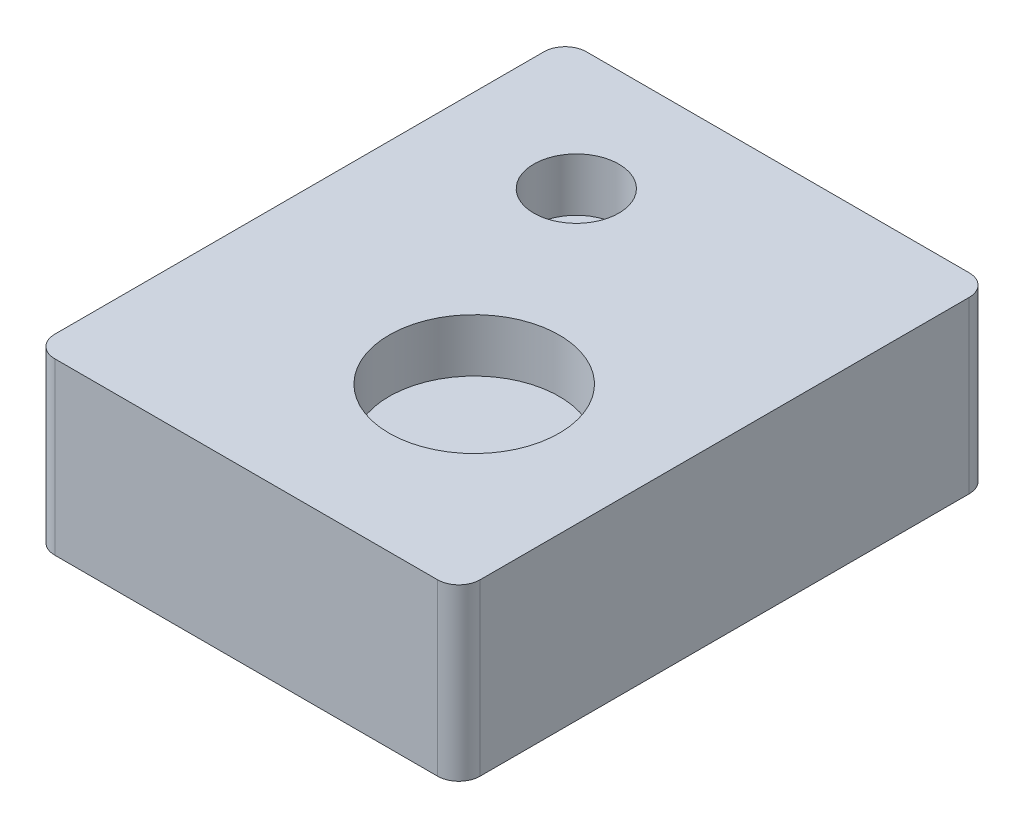
ISO-10303-21;
HEADER;
FILE_DESCRIPTION(('STEP AP214'),'2;1');
FILE_NAME('part.step','',(''),(''),'','','');
FILE_SCHEMA(('AUTOMOTIVE_DESIGN { 1 0 10303 214 1 1 1 1 }'));
ENDSEC;
DATA;
#1=APPLICATION_CONTEXT('core data for automotive mechanical design processes');
#2=APPLICATION_PROTOCOL_DEFINITION('international standard','automotive_design',2000,#1);
#3=PRODUCT_CONTEXT('',#1,'mechanical');
#4=PRODUCT('Part','Part','',(#3));
#5=PRODUCT_RELATED_PRODUCT_CATEGORY('part','',(#4));
#6=PRODUCT_DEFINITION_FORMATION('','',#4);
#7=PRODUCT_DEFINITION_CONTEXT('part definition',#1,'design');
#8=PRODUCT_DEFINITION('design','',#6,#7);
#9=PRODUCT_DEFINITION_SHAPE('','',#8);
#10=(LENGTH_UNIT() NAMED_UNIT(*) SI_UNIT(.MILLI.,.METRE.));
#11=(NAMED_UNIT(*) PLANE_ANGLE_UNIT() SI_UNIT($,.RADIAN.));
#12=(NAMED_UNIT(*) SI_UNIT($,.STERADIAN.) SOLID_ANGLE_UNIT());
#13=UNCERTAINTY_MEASURE_WITH_UNIT(LENGTH_MEASURE(1.E-05),#10,'distance_accuracy_value','');
#14=(GEOMETRIC_REPRESENTATION_CONTEXT(3) GLOBAL_UNCERTAINTY_ASSIGNED_CONTEXT((#13)) GLOBAL_UNIT_ASSIGNED_CONTEXT((#10,
#11,#12)) REPRESENTATION_CONTEXT('',''));
#15=CARTESIAN_POINT('',(0.,0.,0.));
#16=DIRECTION('',(0.,0.,1.));
#17=DIRECTION('',(1.,0.,0.));
#18=AXIS2_PLACEMENT_3D('',#15,#16,#17);
#19=CARTESIAN_POINT('',(-8.13829787234044,8.,-7.4468085106383));
#20=DIRECTION('',(0.,0.,-1.));
#21=DIRECTION('',(-1.,0.,0.));
#22=AXIS2_PLACEMENT_3D('',#19,#20,#21);
#23=PLANE('',#22);
#24=DIRECTION('',(1.,0.,0.));
#25=VECTOR('',#24,1.);
#26=CARTESIAN_POINT('',(-8.13829787234044,8.,-7.4468085106383));
#27=LINE('',#26,#25);
#28=CARTESIAN_POINT('',(-7.13829787234044,8.,-7.4468085106383));
#29=VERTEX_POINT('',#28);
#30=CARTESIAN_POINT('',(10.8617021276596,8.,-7.4468085106383));
#31=VERTEX_POINT('',#30);
#32=EDGE_CURVE('E155',#29,#31,#27,.T.);
#33=ORIENTED_EDGE('',*,*,#32,.T.);
#34=DIRECTION('',(0.,-1.,0.));
#35=VECTOR('',#34,1.);
#36=CARTESIAN_POINT('',(10.8617021276596,8.,-7.4468085106383));
#37=LINE('',#36,#35);
#38=CARTESIAN_POINT('',(10.8617021276596,0.,-7.4468085106383));
#39=VERTEX_POINT('',#38);
#40=EDGE_CURVE('E151',#31,#39,#37,.T.);
#41=ORIENTED_EDGE('',*,*,#40,.T.);
#42=DIRECTION('',(1.,0.,0.));
#43=VECTOR('',#42,1.);
#44=CARTESIAN_POINT('',(-8.13829787234044,0.,-7.4468085106383));
#45=LINE('',#44,#43);
#46=CARTESIAN_POINT('',(-7.13829787234044,0.,-7.4468085106383));
#47=VERTEX_POINT('',#46);
#48=EDGE_CURVE('E104',#47,#39,#45,.T.);
#49=ORIENTED_EDGE('',*,*,#48,.F.);
#50=DIRECTION('',(0.,-1.,0.));
#51=VECTOR('',#50,1.);
#52=CARTESIAN_POINT('',(-7.13829787234044,8.,-7.4468085106383));
#53=LINE('',#52,#51);
#54=EDGE_CURVE('E149',#47,#29,#53,.F.);
#55=ORIENTED_EDGE('',*,*,#54,.T.);
#56=EDGE_LOOP('',(#33,#41,#49,#55));
#57=FACE_BOUND('',#56,.T.);
#58=ADVANCED_FACE('F33',(#57),#23,.T.);
#59=CARTESIAN_POINT('',(-8.13829787234044,8.,-7.4468085106383));
#60=DIRECTION('',(1.,0.,0.));
#61=DIRECTION('',(0.,0.,-1.));
#62=AXIS2_PLACEMENT_3D('',#59,#60,#61);
#63=PLANE('',#62);
#64=DIRECTION('',(0.,0.,1.));
#65=VECTOR('',#64,1.);
#66=CARTESIAN_POINT('',(-8.13829787234044,8.,-7.4468085106383));
#67=LINE('',#66,#65);
#68=CARTESIAN_POINT('',(-8.13829787234044,8.,-6.4468085106383));
#69=VERTEX_POINT('',#68);
#70=CARTESIAN_POINT('',(-8.13829787234043,8.,16.5531914893617));
#71=VERTEX_POINT('',#70);
#72=EDGE_CURVE('E125',#69,#71,#67,.T.);
#73=ORIENTED_EDGE('',*,*,#72,.F.);
#74=DIRECTION('',(0.,-1.,0.));
#75=VECTOR('',#74,1.);
#76=CARTESIAN_POINT('',(-8.13829787234044,0.,-6.4468085106383));
#77=LINE('',#76,#75);
#78=CARTESIAN_POINT('',(-8.13829787234044,0.,-6.4468085106383));
#79=VERTEX_POINT('',#78);
#80=EDGE_CURVE('E11',#69,#79,#77,.T.);
#81=ORIENTED_EDGE('',*,*,#80,.T.);
#82=DIRECTION('',(0.,0.,1.));
#83=VECTOR('',#82,1.);
#84=CARTESIAN_POINT('',(-8.13829787234044,0.,-7.4468085106383));
#85=LINE('',#84,#83);
#86=CARTESIAN_POINT('',(-8.13829787234043,0.,16.5531914893617));
#87=VERTEX_POINT('',#86);
#88=EDGE_CURVE('E132',#79,#87,#85,.T.);
#89=ORIENTED_EDGE('',*,*,#88,.T.);
#90=DIRECTION('',(0.,-1.,0.));
#91=VECTOR('',#90,1.);
#92=CARTESIAN_POINT('',(-8.13829787234043,8.,16.5531914893617));
#93=LINE('',#92,#91);
#94=EDGE_CURVE('E41',#87,#71,#93,.F.);
#95=ORIENTED_EDGE('',*,*,#94,.T.);
#96=EDGE_LOOP('',(#73,#81,#89,#95));
#97=FACE_BOUND('',#96,.T.);
#98=ADVANCED_FACE('F180',(#97),#63,.F.);
#99=CARTESIAN_POINT('',(-8.13829787234043,8.,17.5531914893617));
#100=DIRECTION('',(0.,0.,-1.));
#101=DIRECTION('',(-1.,0.,0.));
#102=AXIS2_PLACEMENT_3D('',#99,#100,#101);
#103=PLANE('',#102);
#104=DIRECTION('',(1.,0.,0.));
#105=VECTOR('',#104,1.);
#106=CARTESIAN_POINT('',(-8.13829787234043,0.,17.5531914893617));
#107=LINE('',#106,#105);
#108=CARTESIAN_POINT('',(-7.13829787234043,0.,17.5531914893617));
#109=VERTEX_POINT('',#108);
#110=CARTESIAN_POINT('',(10.8617021276596,0.,17.5531914893617));
#111=VERTEX_POINT('',#110);
#112=EDGE_CURVE('E120',#109,#111,#107,.T.);
#113=ORIENTED_EDGE('',*,*,#112,.T.);
#114=DIRECTION('',(0.,-1.,0.));
#115=VECTOR('',#114,1.);
#116=CARTESIAN_POINT('',(10.8617021276596,8.,17.5531914893617));
#117=LINE('',#116,#115);
#118=CARTESIAN_POINT('',(10.8617021276596,8.,17.5531914893617));
#119=VERTEX_POINT('',#118);
#120=EDGE_CURVE('E141',#111,#119,#117,.F.);
#121=ORIENTED_EDGE('',*,*,#120,.T.);
#122=DIRECTION('',(1.,0.,0.));
#123=VECTOR('',#122,1.);
#124=CARTESIAN_POINT('',(-8.13829787234043,8.,17.5531914893617));
#125=LINE('',#124,#123);
#126=CARTESIAN_POINT('',(-7.13829787234043,8.,17.5531914893617));
#127=VERTEX_POINT('',#126);
#128=EDGE_CURVE('E129',#127,#119,#125,.T.);
#129=ORIENTED_EDGE('',*,*,#128,.F.);
#130=DIRECTION('',(0.,-1.,0.));
#131=VECTOR('',#130,1.);
#132=CARTESIAN_POINT('',(-7.13829787234043,8.,17.5531914893617));
#133=LINE('',#132,#131);
#134=EDGE_CURVE('E138',#127,#109,#133,.T.);
#135=ORIENTED_EDGE('',*,*,#134,.T.);
#136=EDGE_LOOP('',(#113,#121,#129,#135));
#137=FACE_BOUND('',#136,.T.);
#138=ADVANCED_FACE('F170',(#137),#103,.F.);
#139=CARTESIAN_POINT('',(11.8617021276596,8.,-7.4468085106383));
#140=DIRECTION('',(1.,0.,0.));
#141=DIRECTION('',(0.,0.,-1.));
#142=AXIS2_PLACEMENT_3D('',#139,#140,#141);
#143=PLANE('',#142);
#144=DIRECTION('',(0.,0.,1.));
#145=VECTOR('',#144,1.);
#146=CARTESIAN_POINT('',(11.8617021276596,8.,-7.4468085106383));
#147=LINE('',#146,#145);
#148=CARTESIAN_POINT('',(11.8617021276596,8.,-6.4468085106383));
#149=VERTEX_POINT('',#148);
#150=CARTESIAN_POINT('',(11.8617021276596,8.,16.5531914893617));
#151=VERTEX_POINT('',#150);
#152=EDGE_CURVE('E156',#149,#151,#147,.T.);
#153=ORIENTED_EDGE('',*,*,#152,.T.);
#154=DIRECTION('',(0.,-1.,0.));
#155=VECTOR('',#154,1.);
#156=CARTESIAN_POINT('',(11.8617021276596,0.,16.5531914893617));
#157=LINE('',#156,#155);
#158=CARTESIAN_POINT('',(11.8617021276596,0.,16.5531914893617));
#159=VERTEX_POINT('',#158);
#160=EDGE_CURVE('E119',#151,#159,#157,.T.);
#161=ORIENTED_EDGE('',*,*,#160,.T.);
#162=DIRECTION('',(0.,0.,1.));
#163=VECTOR('',#162,1.);
#164=CARTESIAN_POINT('',(11.8617021276596,0.,-7.4468085106383));
#165=LINE('',#164,#163);
#166=CARTESIAN_POINT('',(11.8617021276596,0.,-6.4468085106383));
#167=VERTEX_POINT('',#166);
#168=EDGE_CURVE('E102',#167,#159,#165,.T.);
#169=ORIENTED_EDGE('',*,*,#168,.F.);
#170=DIRECTION('',(0.,-1.,0.));
#171=VECTOR('',#170,1.);
#172=CARTESIAN_POINT('',(11.8617021276596,8.,-6.4468085106383));
#173=LINE('',#172,#171);
#174=EDGE_CURVE('E116',#167,#149,#173,.F.);
#175=ORIENTED_EDGE('',*,*,#174,.T.);
#176=EDGE_LOOP('',(#153,#161,#169,#175));
#177=FACE_BOUND('',#176,.T.);
#178=ADVANCED_FACE('F115',(#177),#143,.T.);
#179=CARTESIAN_POINT('',(0.,8.,0.));
#180=DIRECTION('',(0.,-1.,0.));
#181=DIRECTION('',(0.,0.,-1.));
#182=AXIS2_PLACEMENT_3D('',#179,#180,#181);
#183=PLANE('',#182);
#184=CARTESIAN_POINT('',(-1.80400347859011,8.,-1.63671331895505));
#185=DIRECTION('',(0.,1.,0.));
#186=DIRECTION('',(0.,0.,1.));
#187=AXIS2_PLACEMENT_3D('',#184,#185,#186);
#188=CIRCLE('',#187,2.);
#189=CARTESIAN_POINT('',(-1.80400347859011,8.,0.363286681044954));
#190=VERTEX_POINT('',#189);
#191=EDGE_CURVE('E269',#190,#190,#188,.T.);
#192=ORIENTED_EDGE('',*,*,#191,.F.);
#193=EDGE_LOOP('',(#192));
#194=FACE_BOUND('',#193,.T.);
#195=CARTESIAN_POINT('',(3.75591829280281,8.,8.72495907318631));
#196=DIRECTION('',(0.,1.,0.));
#197=DIRECTION('',(0.,0.,1.));
#198=AXIS2_PLACEMENT_3D('',#195,#196,#197);
#199=CIRCLE('',#198,4.);
#200=CARTESIAN_POINT('',(3.75591829280281,8.,12.7249590731863));
#201=VERTEX_POINT('',#200);
#202=EDGE_CURVE('E160',#201,#201,#199,.T.);
#203=ORIENTED_EDGE('',*,*,#202,.F.);
#204=EDGE_LOOP('',(#203));
#205=FACE_BOUND('',#204,.T.);
#206=ORIENTED_EDGE('',*,*,#128,.T.);
#207=CARTESIAN_POINT('',(10.8617021276596,8.,16.5531914893617));
#208=DIRECTION('',(0.,-1.,0.));
#209=DIRECTION('',(0.,0.,-1.));
#210=AXIS2_PLACEMENT_3D('',#207,#208,#209);
#211=CIRCLE('',#210,1.);
#212=EDGE_CURVE('E147',#119,#151,#211,.F.);
#213=ORIENTED_EDGE('',*,*,#212,.T.);
#214=ORIENTED_EDGE('',*,*,#152,.F.);
#215=CARTESIAN_POINT('',(10.8617021276596,8.,-6.4468085106383));
#216=DIRECTION('',(0.,-1.,0.));
#217=DIRECTION('',(0.,0.,-1.));
#218=AXIS2_PLACEMENT_3D('',#215,#216,#217);
#219=CIRCLE('',#218,1.);
#220=EDGE_CURVE('E124',#149,#31,#219,.F.);
#221=ORIENTED_EDGE('',*,*,#220,.T.);
#222=ORIENTED_EDGE('',*,*,#32,.F.);
#223=CARTESIAN_POINT('',(-7.13829787234044,8.,-6.4468085106383));
#224=DIRECTION('',(0.,-1.,0.));
#225=DIRECTION('',(0.,0.,-1.));
#226=AXIS2_PLACEMENT_3D('',#223,#224,#225);
#227=CIRCLE('',#226,1.);
#228=EDGE_CURVE('E54',#29,#69,#227,.F.);
#229=ORIENTED_EDGE('',*,*,#228,.T.);
#230=ORIENTED_EDGE('',*,*,#72,.T.);
#231=CARTESIAN_POINT('',(-7.13829787234043,8.,16.5531914893617));
#232=DIRECTION('',(0.,-1.,0.));
#233=DIRECTION('',(0.,0.,-1.));
#234=AXIS2_PLACEMENT_3D('',#231,#232,#233);
#235=CIRCLE('',#234,1.);
#236=EDGE_CURVE('E143',#71,#127,#235,.F.);
#237=ORIENTED_EDGE('',*,*,#236,.T.);
#238=EDGE_LOOP('',(#206,#213,#214,#221,#222,#229,#230,#237));
#239=FACE_BOUND('',#238,.T.);
#240=ADVANCED_FACE('F176',(#194,#205,#239),#183,.F.);
#241=CARTESIAN_POINT('',(0.,0.,0.));
#242=DIRECTION('',(0.,-1.,0.));
#243=DIRECTION('',(0.,0.,-1.));
#244=AXIS2_PLACEMENT_3D('',#241,#242,#243);
#245=PLANE('',#244);
#246=ORIENTED_EDGE('',*,*,#168,.T.);
#247=CARTESIAN_POINT('',(10.8617021276596,0.,16.5531914893617));
#248=DIRECTION('',(0.,-1.,0.));
#249=DIRECTION('',(0.,0.,-1.));
#250=AXIS2_PLACEMENT_3D('',#247,#248,#249);
#251=CIRCLE('',#250,1.);
#252=EDGE_CURVE('E109',#159,#111,#251,.T.);
#253=ORIENTED_EDGE('',*,*,#252,.T.);
#254=ORIENTED_EDGE('',*,*,#112,.F.);
#255=CARTESIAN_POINT('',(-7.13829787234043,0.,16.5531914893617));
#256=DIRECTION('',(0.,-1.,0.));
#257=DIRECTION('',(0.,0.,-1.));
#258=AXIS2_PLACEMENT_3D('',#255,#256,#257);
#259=CIRCLE('',#258,1.);
#260=EDGE_CURVE('E127',#109,#87,#259,.T.);
#261=ORIENTED_EDGE('',*,*,#260,.T.);
#262=ORIENTED_EDGE('',*,*,#88,.F.);
#263=CARTESIAN_POINT('',(-7.13829787234044,0.,-6.4468085106383));
#264=DIRECTION('',(0.,-1.,0.));
#265=DIRECTION('',(0.,0.,-1.));
#266=AXIS2_PLACEMENT_3D('',#263,#264,#265);
#267=CIRCLE('',#266,1.);
#268=EDGE_CURVE('E110',#79,#47,#267,.T.);
#269=ORIENTED_EDGE('',*,*,#268,.T.);
#270=ORIENTED_EDGE('',*,*,#48,.T.);
#271=CARTESIAN_POINT('',(10.8617021276596,0.,-6.4468085106383));
#272=DIRECTION('',(0.,-1.,0.));
#273=DIRECTION('',(0.,0.,-1.));
#274=AXIS2_PLACEMENT_3D('',#271,#272,#273);
#275=CIRCLE('',#274,1.);
#276=EDGE_CURVE('E99',#39,#167,#275,.T.);
#277=ORIENTED_EDGE('',*,*,#276,.T.);
#278=EDGE_LOOP('',(#246,#253,#254,#261,#262,#269,#270,#277));
#279=FACE_BOUND('',#278,.T.);
#280=ADVANCED_FACE('F101',(#279),#245,.T.);
#281=CARTESIAN_POINT('',(10.8617021276596,8.,16.5531914893617));
#282=DIRECTION('',(0.,1.,0.));
#283=DIRECTION('',(0.,0.,1.));
#284=AXIS2_PLACEMENT_3D('',#281,#282,#283);
#285=CYLINDRICAL_SURFACE('',#284,1.);
#286=ORIENTED_EDGE('',*,*,#212,.F.);
#287=ORIENTED_EDGE('',*,*,#120,.F.);
#288=ORIENTED_EDGE('',*,*,#252,.F.);
#289=ORIENTED_EDGE('',*,*,#160,.F.);
#290=EDGE_LOOP('',(#286,#287,#288,#289));
#291=FACE_BOUND('',#290,.T.);
#292=ADVANCED_FACE('F175',(#291),#285,.T.);
#293=CARTESIAN_POINT('',(10.8617021276596,8.,-6.4468085106383));
#294=DIRECTION('',(0.,-1.,0.));
#295=DIRECTION('',(0.,0.,-1.));
#296=AXIS2_PLACEMENT_3D('',#293,#294,#295);
#297=CYLINDRICAL_SURFACE('',#296,1.);
#298=ORIENTED_EDGE('',*,*,#220,.F.);
#299=ORIENTED_EDGE('',*,*,#174,.F.);
#300=ORIENTED_EDGE('',*,*,#276,.F.);
#301=ORIENTED_EDGE('',*,*,#40,.F.);
#302=EDGE_LOOP('',(#298,#299,#300,#301));
#303=FACE_BOUND('',#302,.T.);
#304=ADVANCED_FACE('F123',(#303),#297,.T.);
#305=CARTESIAN_POINT('',(-7.13829787234044,8.,-6.4468085106383));
#306=DIRECTION('',(0.,1.,0.));
#307=DIRECTION('',(0.,0.,1.));
#308=AXIS2_PLACEMENT_3D('',#305,#306,#307);
#309=CYLINDRICAL_SURFACE('',#308,1.);
#310=ORIENTED_EDGE('',*,*,#228,.F.);
#311=ORIENTED_EDGE('',*,*,#54,.F.);
#312=ORIENTED_EDGE('',*,*,#268,.F.);
#313=ORIENTED_EDGE('',*,*,#80,.F.);
#314=EDGE_LOOP('',(#310,#311,#312,#313));
#315=FACE_BOUND('',#314,.T.);
#316=ADVANCED_FACE('F183',(#315),#309,.T.);
#317=CARTESIAN_POINT('',(-7.13829787234043,8.,16.5531914893617));
#318=DIRECTION('',(0.,-1.,0.));
#319=DIRECTION('',(0.,0.,-1.));
#320=AXIS2_PLACEMENT_3D('',#317,#318,#319);
#321=CYLINDRICAL_SURFACE('',#320,1.);
#322=ORIENTED_EDGE('',*,*,#236,.F.);
#323=ORIENTED_EDGE('',*,*,#94,.F.);
#324=ORIENTED_EDGE('',*,*,#260,.F.);
#325=ORIENTED_EDGE('',*,*,#134,.F.);
#326=EDGE_LOOP('',(#322,#323,#324,#325));
#327=FACE_BOUND('',#326,.T.);
#328=ADVANCED_FACE('F35',(#327),#321,.T.);
#329=CARTESIAN_POINT('',(3.75591829280281,5.5,8.72495907318631));
#330=DIRECTION('',(0.,1.,0.));
#331=DIRECTION('',(0.,0.,1.));
#332=AXIS2_PLACEMENT_3D('',#329,#330,#331);
#333=CYLINDRICAL_SURFACE('',#332,4.);
#334=CARTESIAN_POINT('',(3.75591829280281,5.5,8.72495907318631));
#335=DIRECTION('',(0.,1.,0.));
#336=DIRECTION('',(0.,0.,1.));
#337=AXIS2_PLACEMENT_3D('',#334,#335,#336);
#338=CIRCLE('',#337,4.);
#339=CARTESIAN_POINT('',(3.75591829280281,5.5,12.7249590731863));
#340=VERTEX_POINT('',#339);
#341=EDGE_CURVE('E272',#340,#340,#338,.T.);
#342=ORIENTED_EDGE('',*,*,#341,.F.);
#343=EDGE_LOOP('',(#342));
#344=FACE_BOUND('',#343,.T.);
#345=ORIENTED_EDGE('',*,*,#202,.T.);
#346=EDGE_LOOP('',(#345));
#347=FACE_BOUND('',#346,.T.);
#348=ADVANCED_FACE('F189',(#344,#347),#333,.F.);
#349=CARTESIAN_POINT('',(3.75591829280281,5.5,8.72495907318631));
#350=DIRECTION('',(0.,1.,0.));
#351=DIRECTION('',(0.,0.,1.));
#352=AXIS2_PLACEMENT_3D('',#349,#350,#351);
#353=PLANE('',#352);
#354=ORIENTED_EDGE('',*,*,#341,.T.);
#355=EDGE_LOOP('',(#354));
#356=FACE_BOUND('',#355,.T.);
#357=ADVANCED_FACE('F234',(#356),#353,.T.);
#358=CARTESIAN_POINT('',(-1.80400347859011,5.5,-1.63671331895505));
#359=DIRECTION('',(0.,1.,0.));
#360=DIRECTION('',(0.,0.,1.));
#361=AXIS2_PLACEMENT_3D('',#358,#359,#360);
#362=CYLINDRICAL_SURFACE('',#361,2.);
#363=CARTESIAN_POINT('',(-1.80400347859011,5.5,-1.63671331895505));
#364=DIRECTION('',(0.,1.,0.));
#365=DIRECTION('',(0.,0.,1.));
#366=AXIS2_PLACEMENT_3D('',#363,#364,#365);
#367=CIRCLE('',#366,2.);
#368=CARTESIAN_POINT('',(-1.80400347859011,5.5,0.363286681044954));
#369=VERTEX_POINT('',#368);
#370=EDGE_CURVE('E165',#369,#369,#367,.T.);
#371=ORIENTED_EDGE('',*,*,#370,.F.);
#372=EDGE_LOOP('',(#371));
#373=FACE_BOUND('',#372,.T.);
#374=ORIENTED_EDGE('',*,*,#191,.T.);
#375=EDGE_LOOP('',(#374));
#376=FACE_BOUND('',#375,.T.);
#377=ADVANCED_FACE('F243',(#373,#376),#362,.F.);
#378=CARTESIAN_POINT('',(-1.80400347859011,5.5,-1.63671331895505));
#379=DIRECTION('',(0.,1.,0.));
#380=DIRECTION('',(0.,0.,1.));
#381=AXIS2_PLACEMENT_3D('',#378,#379,#380);
#382=PLANE('',#381);
#383=ORIENTED_EDGE('',*,*,#370,.T.);
#384=EDGE_LOOP('',(#383));
#385=FACE_BOUND('',#384,.T.);
#386=ADVANCED_FACE('F253',(#385),#382,.T.);
#387=CLOSED_SHELL('',(#58,#98,#138,#178,#240,#280,#292,#304,#316,#328,#348,#357,#377,#386));
#388=MANIFOLD_SOLID_BREP('B2',#387);
#389=ADVANCED_BREP_SHAPE_REPRESENTATION('',(#18,#388),#14);
#390=SHAPE_DEFINITION_REPRESENTATION(#9,#389);
ENDSEC;
END-ISO-10303-21;
